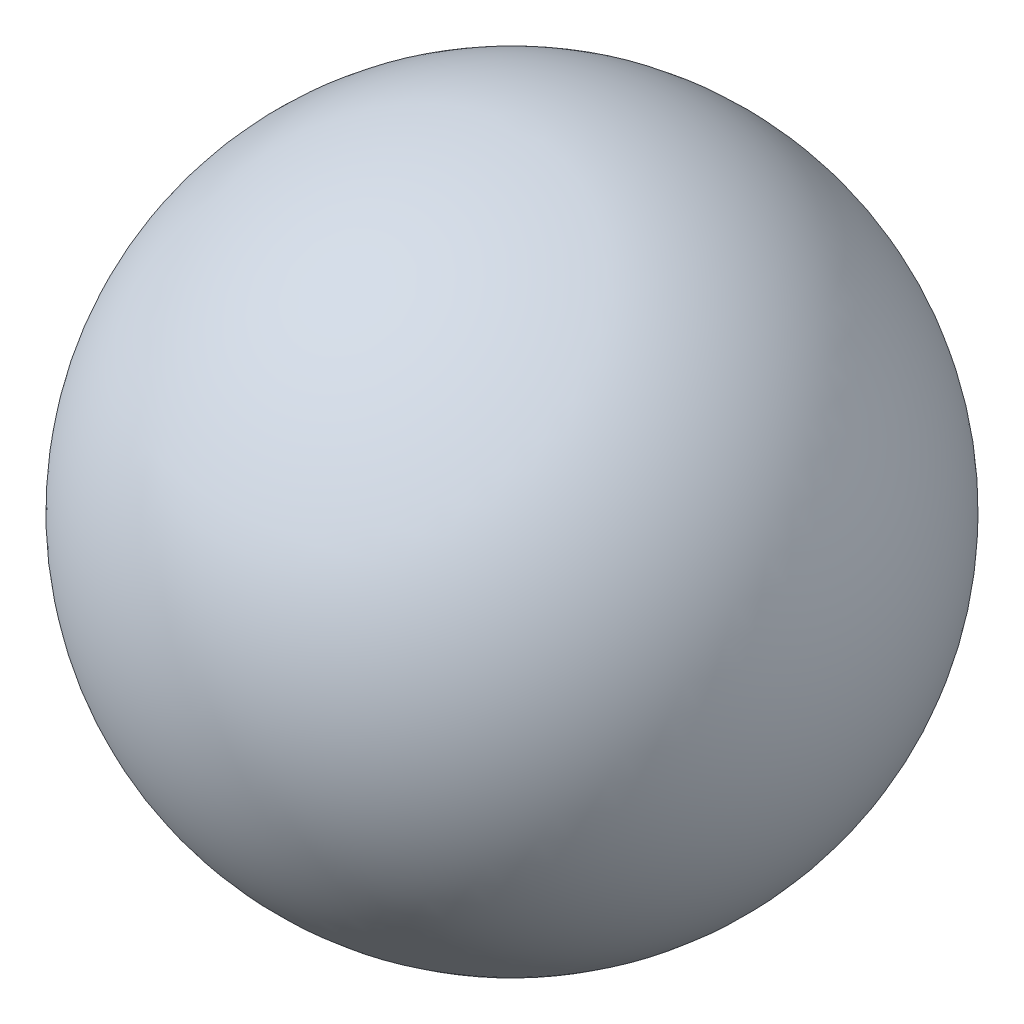
ISO-10303-21;
HEADER;
FILE_DESCRIPTION(('STEP AP214'),'2;1');
FILE_NAME('part.step','',(''),(''),'','','');
FILE_SCHEMA(('AUTOMOTIVE_DESIGN { 1 0 10303 214 1 1 1 1 }'));
ENDSEC;
DATA;
#1=APPLICATION_CONTEXT('core data for automotive mechanical design processes');
#2=APPLICATION_PROTOCOL_DEFINITION('international standard','automotive_design',2000,#1);
#3=PRODUCT_CONTEXT('',#1,'mechanical');
#4=PRODUCT('Part','Part','',(#3));
#5=PRODUCT_RELATED_PRODUCT_CATEGORY('part','',(#4));
#6=PRODUCT_DEFINITION_FORMATION('','',#4);
#7=PRODUCT_DEFINITION_CONTEXT('part definition',#1,'design');
#8=PRODUCT_DEFINITION('design','',#6,#7);
#9=PRODUCT_DEFINITION_SHAPE('','',#8);
#10=(LENGTH_UNIT() NAMED_UNIT(*) SI_UNIT(.MILLI.,.METRE.));
#11=(NAMED_UNIT(*) PLANE_ANGLE_UNIT() SI_UNIT($,.RADIAN.));
#12=(NAMED_UNIT(*) SI_UNIT($,.STERADIAN.) SOLID_ANGLE_UNIT());
#13=UNCERTAINTY_MEASURE_WITH_UNIT(LENGTH_MEASURE(1.E-05),#10,'distance_accuracy_value','');
#14=(GEOMETRIC_REPRESENTATION_CONTEXT(3) GLOBAL_UNCERTAINTY_ASSIGNED_CONTEXT((#13)) GLOBAL_UNIT_ASSIGNED_CONTEXT((#10,
#11,#12)) REPRESENTATION_CONTEXT('',''));
#15=CARTESIAN_POINT('',(0.,0.,0.));
#16=DIRECTION('',(0.,0.,1.));
#17=DIRECTION('',(1.,0.,0.));
#18=AXIS2_PLACEMENT_3D('',#15,#16,#17);
#19=CARTESIAN_POINT('',(0.,30.,0.));
#20=DIRECTION('',(0.,0.,1.));
#21=DIRECTION('',(1.,0.,0.));
#22=AXIS2_PLACEMENT_3D('',#19,#20,#21);
#23=PLANE('',#22);
#24=CARTESIAN_POINT('',(0.,30.,0.));
#25=DIRECTION('',(0.,0.,1.));
#26=DIRECTION('',(1.,0.,0.));
#27=AXIS2_PLACEMENT_3D('',#24,#25,#26);
#28=CIRCLE('',#27,6.325);
#29=CARTESIAN_POINT('',(3.87370946251781,35.,0.));
#30=VERTEX_POINT('',#29);
#31=CARTESIAN_POINT('',(-3.87370946251781,35.,0.));
#32=VERTEX_POINT('',#31);
#33=EDGE_CURVE('E111',#30,#32,#28,.T.);
#34=ORIENTED_EDGE('',*,*,#33,.F.);
#35=DIRECTION('',(-1.,0.,0.));
#36=VECTOR('',#35,1.);
#37=CARTESIAN_POINT('',(0.,35.,0.));
#38=LINE('',#37,#36);
#39=EDGE_CURVE('E160',#30,#32,#38,.T.);
#40=ORIENTED_EDGE('',*,*,#39,.T.);
#41=EDGE_LOOP('',(#34,#40));
#42=FACE_BOUND('',#41,.T.);
#43=ADVANCED_FACE('F38',(#42),#23,.F.);
#44=CARTESIAN_POINT('',(-5.,33.8737094625178,0.));
#45=VERTEX_POINT('',#44);
#46=CARTESIAN_POINT('',(-5.,26.1262905374822,0.));
#47=VERTEX_POINT('',#46);
#48=EDGE_CURVE('E105',#45,#47,#28,.T.);
#49=ORIENTED_EDGE('',*,*,#48,.F.);
#50=DIRECTION('',(0.,-1.,0.));
#51=VECTOR('',#50,1.);
#52=CARTESIAN_POINT('',(-5.,30.,0.));
#53=LINE('',#52,#51);
#54=EDGE_CURVE('E99',#47,#45,#53,.F.);
#55=ORIENTED_EDGE('',*,*,#54,.F.);
#56=EDGE_LOOP('',(#49,#55));
#57=FACE_BOUND('',#56,.T.);
#58=ADVANCED_FACE('F175',(#57),#23,.F.);
#59=CARTESIAN_POINT('',(0.,30.,0.));
#60=DIRECTION('',(0.,-1.,0.));
#61=DIRECTION('',(-1.,0.,0.));
#62=AXIS2_PLACEMENT_3D('',#59,#60,#61);
#63=SPHERICAL_SURFACE('',#62,30.);
#64=CARTESIAN_POINT('',(0.,30.,-29.3256606916196));
#65=DIRECTION('',(0.,0.,1.));
#66=DIRECTION('',(1.,0.,0.));
#67=AXIS2_PLACEMENT_3D('',#64,#65,#66);
#68=CIRCLE('',#67,6.325);
#69=CARTESIAN_POINT('',(6.325,30.,-29.3256606916196));
#70=VERTEX_POINT('',#69);
#71=EDGE_CURVE('E100',#70,#70,#68,.F.);
#72=ORIENTED_EDGE('',*,*,#71,.F.);
#73=EDGE_LOOP('',(#72));
#74=FACE_BOUND('',#73,.T.);
#75=CARTESIAN_POINT('',(0.,0.419601084501918,0.));
#76=DIRECTION('',(0.,1.,0.));
#77=DIRECTION('',(0.,0.,1.));
#78=AXIS2_PLACEMENT_3D('',#75,#76,#77);
#79=CIRCLE('',#78,5.);
#80=CARTESIAN_POINT('',(0.,0.419601084501918,5.));
#81=VERTEX_POINT('',#80);
#82=EDGE_CURVE('E107',#81,#81,#79,.T.);
#83=ORIENTED_EDGE('',*,*,#82,.T.);
#84=EDGE_LOOP('',(#83));
#85=FACE_BOUND('',#84,.T.);
#86=ADVANCED_FACE('F177',(#74,#85),#63,.T.);
#87=CARTESIAN_POINT('',(0.,30.,-35.));
#88=DIRECTION('',(0.,0.,1.));
#89=DIRECTION('',(1.,0.,0.));
#90=AXIS2_PLACEMENT_3D('',#87,#88,#89);
#91=CYLINDRICAL_SURFACE('',#90,6.325);
#92=ORIENTED_EDGE('',*,*,#71,.T.);
#93=EDGE_LOOP('',(#92));
#94=FACE_BOUND('',#93,.T.);
#95=CARTESIAN_POINT('',(5.,26.1262905374822,0.));
#96=CARTESIAN_POINT('',(5.00002215990569,26.1263500669757,-0.0963123124597829));
#97=CARTESIAN_POINT('',(4.99721823765796,26.1227002121737,-0.192589029495187));
#98=CARTESIAN_POINT('',(4.98613621279756,26.1084431338061,-0.384155402048068));
#99=CARTESIAN_POINT('',(4.97786708605443,26.0978473182865,-0.479446416258402));
#100=CARTESIAN_POINT('',(4.95617290452398,26.0703361589931,-0.667222877225731));
#101=CARTESIAN_POINT('',(4.94281597187234,26.0535043884465,-0.759728673406279));
#102=CARTESIAN_POINT('',(4.91120275145371,26.0142314297893,-0.942715159353085));
#103=CARTESIAN_POINT('',(4.8929441117343,25.9917875492138,-1.03319485431026));
#104=CARTESIAN_POINT('',(4.84469186013526,25.9334946420499,-1.2426458170073));
#105=CARTESIAN_POINT('',(4.81282379759819,25.8956943227622,-1.36064336252905));
#106=CARTESIAN_POINT('',(4.74138048780479,25.8133660152691,-1.59184380646212));
#107=CARTESIAN_POINT('',(4.70180265644325,25.7688357725011,-1.70504508176247));
#108=CARTESIAN_POINT('',(4.61519298294151,25.6745239744254,-1.92725348503715));
#109=CARTESIAN_POINT('',(4.56811398835707,25.6247099155351,-2.03622826290285));
#110=CARTESIAN_POINT('',(4.46707971735257,25.5216030160014,-2.24924425513877));
#111=CARTESIAN_POINT('',(4.41312247695653,25.4683091838914,-2.35328404871338));
#112=CARTESIAN_POINT('',(4.27919032217002,25.3411028039426,-2.59093129310676));
#113=CARTESIAN_POINT('',(4.1965961374112,25.2663249467098,-2.72260620617775));
#114=CARTESIAN_POINT('',(4.01995184883474,25.1154195349953,-2.9772481074001));
#115=CARTESIAN_POINT('',(3.9258979102402,25.0392915360372,-3.1002121587484));
#116=CARTESIAN_POINT('',(3.72673030293976,24.8879838316645,-3.33696747008663));
#117=CARTESIAN_POINT('',(3.62163930524101,24.8128025243237,-3.45077671684987));
#118=CARTESIAN_POINT('',(3.40038634375665,24.6651417928239,-3.66899545567669));
#119=CARTESIAN_POINT('',(3.28422296604909,24.5926627153828,-3.77340374393632));
#120=CARTESIAN_POINT('',(2.96630772767672,24.4091231311246,-4.03301091855351));
#121=CARTESIAN_POINT('',(2.75571118210646,24.3016214540876,-4.1801511965195));
#122=CARTESIAN_POINT('',(2.30782363944111,24.1060053925234,-4.4431089440391));
#123=CARTESIAN_POINT('',(2.07056958870473,24.0178646633935,-4.55896902664719));
#124=CARTESIAN_POINT('',(1.61264285241522,23.8801443192246,-4.73811583075012));
#125=CARTESIAN_POINT('',(1.39531050902792,23.8266655902658,-4.80682695869841));
#126=CARTESIAN_POINT('',(1.06086113603286,23.7635627637291,-4.88751377026154));
#127=CARTESIAN_POINT('',(0.947936371161891,23.7453783102882,-4.91068278149828));
#128=CARTESIAN_POINT('',(0.719981933243062,23.7150623453049,-4.9492385441858));
#129=CARTESIAN_POINT('',(0.604953114159795,23.7029284321851,-4.9646283833749));
#130=CARTESIAN_POINT('',(0.373184582371842,23.6849445909763,-4.98741898760948));
#131=CARTESIAN_POINT('',(0.25644008737272,23.6791182787872,-4.99478972935236));
#132=CARTESIAN_POINT('',(0.0226204943393651,23.673960151296,-5.00131577206183));
#133=CARTESIAN_POINT('',(-0.0944544602738625,23.6746258544806,-5.00047421210551));
#134=CARTESIAN_POINT('',(-0.32806693948226,23.6824324122936,-4.99059558391115));
#135=CARTESIAN_POINT('',(-0.444604328728926,23.6895748167942,-4.98155655402161));
#136=CARTESIAN_POINT('',(-0.676202456375065,23.7101754971711,-4.95543454743454));
#137=CARTESIAN_POINT('',(-0.791263224709447,23.7236336448025,-4.93835173407067));
#138=CARTESIAN_POINT('',(-1.01321095385844,23.7557270673342,-4.89749640476802));
#139=CARTESIAN_POINT('',(-1.12021378686689,23.7740601883902,-4.87411350710475));
#140=CARTESIAN_POINT('',(-1.33153995438364,23.8158067098254,-4.82067393781666));
#141=CARTESIAN_POINT('',(-1.43586241214606,23.8392217494148,-4.79061511274948));
#142=CARTESIAN_POINT('',(-1.74394343050199,23.916496551248,-4.6909667574753));
#143=CARTESIAN_POINT('',(-1.94295962939164,23.9774075873311,-4.61187822115691));
#144=CARTESIAN_POINT('',(-2.3438539545954,24.1210736910526,-4.42270444006332));
#145=CARTESIAN_POINT('',(-2.54406791240566,24.2053935091191,-4.31032695266239));
#146=CARTESIAN_POINT('',(-2.92321447230977,24.387094781965,-4.06277422700088));
#147=CARTESIAN_POINT('',(-3.10213842326236,24.4844815124842,-3.92758977477));
#148=CARTESIAN_POINT('',(-3.47229607473002,24.7080729549253,-3.60758692683995));
#149=CARTESIAN_POINT('',(-3.65856781897332,24.8360988115131,-3.41827152687097));
#150=CARTESIAN_POINT('',(-3.91346404200393,25.0298977244601,-3.11485076518627));
#151=CARTESIAN_POINT('',(-3.99444058321372,25.0948831787991,-3.01030876290175));
#152=CARTESIAN_POINT('',(-4.14807686850704,25.2241091485609,-2.79481049081281));
#153=CARTESIAN_POINT('',(-4.2207376371153,25.2883497548726,-2.68385501370566));
#154=CARTESIAN_POINT('',(-4.34935572512073,25.40702124788,-2.46917818436625));
#155=CARTESIAN_POINT('',(-4.40627168045877,25.4617086414901,-2.36617119055845));
#156=CARTESIAN_POINT('',(-4.5132327155104,25.5680660918028,-2.15516061905288));
#157=CARTESIAN_POINT('',(-4.56327927251677,25.6197367958792,-2.04715812235941));
#158=CARTESIAN_POINT('',(-4.65588346955843,25.7183039292838,-1.82673382522248));
#159=CARTESIAN_POINT('',(-4.6984830936886,25.7652264513473,-1.71434148054973));
#160=CARTESIAN_POINT('',(-4.77605083548296,25.8529058068027,-1.48459691063914));
#161=CARTESIAN_POINT('',(-4.81102032164443,25.8936637454354,-1.36724557933067));
#162=CARTESIAN_POINT('',(-4.86719137009636,25.9604913766623,-1.149241215604));
#163=CARTESIAN_POINT('',(-4.88973607020151,25.987884255695,-1.0493421242029));
#164=CARTESIAN_POINT('',(-4.92884182715137,26.0360247167883,-0.846845649933849));
#165=CARTESIAN_POINT('',(-4.94540653232967,26.0567763497248,-0.744249953368702));
#166=CARTESIAN_POINT('',(-4.97237482456399,26.0908282215501,-0.535443117661064));
#167=CARTESIAN_POINT('',(-4.98268522317401,26.1040156041477,-0.429201090052687));
#168=CARTESIAN_POINT('',(-4.99652229524022,26.121801681662,-0.215328025426039));
#169=CARTESIAN_POINT('',(-5.00003347488726,26.126380759601,-0.107694377289787));
#170=CARTESIAN_POINT('',(-5.00000000000002,26.1262905374821,0.));
#171=B_SPLINE_CURVE_WITH_KNOTS('',3,(#95,#96,#97,#98,#99,#100,#101,#102,#103,#104,#105,#106,
#107,#108,#109,#110,#111,#112,#113,#114,#115,#116,#117,#118,#119,#120,#121,#122,#123,#124,#125,
#126,#127,#128,#129,#130,#131,#132,#133,#134,#135,#136,#137,#138,#139,#140,#141,#142,#143,#144,
#145,#146,#147,#148,#149,#150,#151,#152,#153,#154,#155,#156,#157,#158,#159,#160,#161,#162,#163,
#164,#165,#166,#167,#168,#169,#170),.UNSPECIFIED.,.F.,.F.,(4,2,2,2,2,2,2,2,2,2,2,2,2,2,2,2,2,2,
2,2,2,2,2,2,2,2,2,2,2,2,2,2,2,2,2,2,2,4),(0.,0.288770139525526,0.577067187245141,
0.861632607390289,1.14633481340648,1.52954347571257,1.91288080084353,2.29873045910826,
2.68469053855319,3.20148747157686,3.71845781775387,4.23438629826341,4.75038075035249,
5.58241128358443,6.41330255458571,7.11238236151246,7.46212032867757,7.81171936730637,
8.16262283910243,8.51339218651603,8.86424549505842,9.2150916796288,9.54787797706081,
9.88077177710585,10.5461198981981,11.2772817723524,12.0087397449738,12.8897406790411,
13.3314830413026,13.7731709210399,14.1622063953371,14.5511580744105,14.9378407718599,
15.3244540590309,15.6421258283145,15.9596034604663,16.2817021789128,16.6045340242698),.UNSPECIFIED.);
#172=CARTESIAN_POINT('',(5.,26.1262905374822,0.));
#173=VERTEX_POINT('',#172);
#174=EDGE_CURVE('E93',#173,#47,#171,.T.);
#175=ORIENTED_EDGE('',*,*,#174,.F.);
#176=CARTESIAN_POINT('',(5.,33.8737094625178,0.));
#177=VERTEX_POINT('',#176);
#178=EDGE_CURVE('E103',#173,#177,#28,.T.);
#179=ORIENTED_EDGE('',*,*,#178,.T.);
#180=CARTESIAN_POINT('',(5.,33.8737094625178,0.));
#181=CARTESIAN_POINT('',(4.99999991431388,33.8737096885773,0.0213453043152271));
#182=CARTESIAN_POINT('',(4.99986328175209,33.873886028122,0.0426859510760669));
#183=CARTESIAN_POINT('',(4.99931692287718,33.8745909341817,0.0853579294887467));
#184=CARTESIAN_POINT('',(4.99890719656407,33.8751195006967,0.106689261140587));
#185=CARTESIAN_POINT('',(4.9983609233753,33.875824180697,0.12801593523804));
#186=B_SPLINE_CURVE_WITH_KNOTS('',3,(#180,#181,#182,#183,#184,#185),.UNSPECIFIED.,.F.,.F.,(4,2,
4),(0.,0.0640254380255696,0.128050876050464),.UNSPECIFIED.);
#187=CARTESIAN_POINT('',(4.99836092337529,33.8758241806969,0.12801593523804));
#188=VERTEX_POINT('',#187);
#189=EDGE_CURVE('E43',#177,#188,#186,.T.);
#190=ORIENTED_EDGE('',*,*,#189,.T.);
#191=CARTESIAN_POINT('',(3.87370946251781,35.,0.));
#192=CARTESIAN_POINT('',(3.98293480894709,34.9154001486259,2.76817009595661E-06));
#193=CARTESIAN_POINT('',(4.08939830568528,34.827169647157,0.00214819165728));
#194=CARTESIAN_POINT('',(4.29552814246442,34.644657519315,0.0118098650661881));
#195=CARTESIAN_POINT('',(4.39523350459646,34.5504180769819,0.0192917719463984));
#196=CARTESIAN_POINT('',(4.5879986720903,34.3559863408574,0.0406856577421378));
#197=CARTESIAN_POINT('',(4.68105734279876,34.2557930360078,0.0545987315044138));
#198=CARTESIAN_POINT('',(4.86048344604895,34.049717267845,0.0900116054872135));
#199=CARTESIAN_POINT('',(4.9468040830105,33.9438024084645,0.111559541193848));
#200=CARTESIAN_POINT('',(5.02913883848106,33.8358033765147,0.137423910943361));
#201=B_SPLINE_CURVE_WITH_KNOTS('',3,(#191,#192,#193,#194,#195,#196,#197,#198,#199,#200),
.UNSPECIFIED.,.F.,.F.,(4,2,2,2,4),(0.,0.414438319069897,0.826233301629811,1.23809841431486,
1.65260782050425),.UNSPECIFIED.);
#202=EDGE_CURVE('E157',#188,#30,#201,.F.);
#203=ORIENTED_EDGE('',*,*,#202,.T.);
#204=ORIENTED_EDGE('',*,*,#33,.T.);
#205=CARTESIAN_POINT('',(-3.87370946251781,35.,0.));
#206=CARTESIAN_POINT('',(-3.98293480894709,34.9154001486259,2.76817009595661E-06));
#207=CARTESIAN_POINT('',(-4.08939830568528,34.827169647157,0.00214819165728));
#208=CARTESIAN_POINT('',(-4.29552814246442,34.644657519315,0.0118098650661881));
#209=CARTESIAN_POINT('',(-4.39523350459646,34.5504180769819,0.0192917719463984));
#210=CARTESIAN_POINT('',(-4.5879986720903,34.3559863408574,0.0406856577421378));
#211=CARTESIAN_POINT('',(-4.68105734279876,34.2557930360078,0.0545987315044138));
#212=CARTESIAN_POINT('',(-4.86048344604895,34.049717267845,0.0900116054872135));
#213=CARTESIAN_POINT('',(-4.9468040830105,33.9438024084645,0.111559541193848));
#214=CARTESIAN_POINT('',(-5.02913883848106,33.8358033765147,0.137423910943361));
#215=B_SPLINE_CURVE_WITH_KNOTS('',3,(#205,#206,#207,#208,#209,#210,#211,#212,#213,#214),
.UNSPECIFIED.,.F.,.F.,(4,2,2,2,4),(0.,0.414438319069897,0.826233301629811,1.23809841431486,
1.65260782050425),.UNSPECIFIED.);
#216=CARTESIAN_POINT('',(-4.99836092337529,33.8758241806969,0.12801593523804));
#217=VERTEX_POINT('',#216);
#218=EDGE_CURVE('E61',#32,#217,#215,.T.);
#219=ORIENTED_EDGE('',*,*,#218,.T.);
#220=CARTESIAN_POINT('',(-4.99836092337529,33.8758241806969,0.12801593523804));
#221=CARTESIAN_POINT('',(-4.99890719656407,33.8751195006967,0.106689261140586));
#222=CARTESIAN_POINT('',(-4.99931692287718,33.8745909341817,0.0853579294887459));
#223=CARTESIAN_POINT('',(-4.99986328175209,33.873886028122,0.0426859510760653));
#224=CARTESIAN_POINT('',(-4.99999991431388,33.8737096885773,0.0213453043152251));
#225=CARTESIAN_POINT('',(-5.,33.8737094625179,0.));
#226=B_SPLINE_CURVE_WITH_KNOTS('',3,(#220,#221,#222,#223,#224,#225),.UNSPECIFIED.,.F.,.F.,(4,2,
4),(0.,0.0640254380248947,0.128050876050465),.UNSPECIFIED.);
#227=EDGE_CURVE('E11',#45,#217,#226,.F.);
#228=ORIENTED_EDGE('',*,*,#227,.F.);
#229=ORIENTED_EDGE('',*,*,#48,.T.);
#230=EDGE_LOOP('',(#175,#179,#190,#203,#204,#219,#228,#229));
#231=FACE_BOUND('',#230,.T.);
#232=ADVANCED_FACE('F102',(#94,#231),#91,.F.);
#233=DIRECTION('',(0.,-1.,0.));
#234=VECTOR('',#233,1.);
#235=CARTESIAN_POINT('',(5.,30.,0.));
#236=LINE('',#235,#234);
#237=EDGE_CURVE('E90',#177,#173,#236,.T.);
#238=ORIENTED_EDGE('',*,*,#237,.F.);
#239=ORIENTED_EDGE('',*,*,#178,.F.);
#240=EDGE_LOOP('',(#238,#239));
#241=FACE_BOUND('',#240,.T.);
#242=ADVANCED_FACE('F109',(#241),#23,.F.);
#243=CARTESIAN_POINT('',(0.,30.,0.));
#244=DIRECTION('',(0.,-1.,0.));
#245=DIRECTION('',(0.,0.,-1.));
#246=AXIS2_PLACEMENT_3D('',#243,#244,#245);
#247=CYLINDRICAL_SURFACE('',#246,5.);
#248=ORIENTED_EDGE('',*,*,#82,.F.);
#249=EDGE_LOOP('',(#248));
#250=FACE_BOUND('',#249,.T.);
#251=ORIENTED_EDGE('',*,*,#54,.T.);
#252=ORIENTED_EDGE('',*,*,#227,.T.);
#253=CARTESIAN_POINT('',(-5.,35.,0.));
#254=CARTESIAN_POINT('',(-4.99995708928931,34.8608120212266,-1.45013408786158E-05));
#255=CARTESIAN_POINT('',(-4.99999864882734,34.7216260771224,0.00581138983767137));
#256=CARTESIAN_POINT('',(-4.99994062123228,34.4442241499699,0.0290396320068588));
#257=CARTESIAN_POINT('',(-4.99984103495852,34.3060081610213,0.0464419125177648));
#258=CARTESIAN_POINT('',(-4.99919006365314,34.0312689301418,0.0927593052125488));
#259=CARTESIAN_POINT('',(-4.9986378843255,33.894749092874,0.121694611836417));
#260=CARTESIAN_POINT('',(-4.996476137854,33.6246126388626,0.190868483485781));
#261=CARTESIAN_POINT('',(-4.99486658439107,33.4909959845791,0.231106902261012));
#262=CARTESIAN_POINT('',(-4.98978938304455,33.2274699578079,0.322648645389495));
#263=CARTESIAN_POINT('',(-4.9863196239305,33.0975649746581,0.373964502414275));
#264=CARTESIAN_POINT('',(-4.97652815328976,32.8425925255067,0.487234762431443));
#265=CARTESIAN_POINT('',(-4.97020661972915,32.7175247581655,0.549188501413262));
#266=CARTESIAN_POINT('',(-4.95356877124832,32.4732880671638,0.683159661724834));
#267=CARTESIAN_POINT('',(-4.94325541306139,32.3541148509366,0.755169609274052));
#268=CARTESIAN_POINT('',(-4.91736953591812,32.1225714846087,0.908583863374879));
#269=CARTESIAN_POINT('',(-4.9017973543741,32.0102008985886,0.989987566991456));
#270=CARTESIAN_POINT('',(-4.86480378516127,31.7974893781012,1.15792167683926));
#271=CARTESIAN_POINT('',(-4.84363353690537,31.6968505112529,1.24412940638407));
#272=CARTESIAN_POINT('',(-4.79404906757774,31.5036555264278,1.42328020163077));
#273=CARTESIAN_POINT('',(-4.76563501243073,31.4110992233793,1.51622311302346));
#274=CARTESIAN_POINT('',(-4.70054216638891,31.2349781851851,1.70736024185755));
#275=CARTESIAN_POINT('',(-4.66387390989616,31.1514021880584,1.80554764526216));
#276=CARTESIAN_POINT('',(-4.58138854271998,30.9937550745697,2.00563618565317));
#277=CARTESIAN_POINT('',(-4.53557302430703,30.9196823076546,2.10753667378008));
#278=CARTESIAN_POINT('',(-4.44113303338272,30.7908509665211,2.29916172430253));
#279=CARTESIAN_POINT('',(-4.39374216508619,30.7348359456743,2.38865320038453));
#280=CARTESIAN_POINT('',(-4.29154236529257,30.6302332780692,2.56773990649322));
#281=CARTESIAN_POINT('',(-4.23673386293921,30.5816452019746,2.65733513022056));
#282=CARTESIAN_POINT('',(-4.11972699368197,30.4917602795158,2.83534745225242));
#283=CARTESIAN_POINT('',(-4.05752841471128,30.4504636424726,2.92376451666728));
#284=CARTESIAN_POINT('',(-3.92595291858719,30.3748312765304,3.09819743947015));
#285=CARTESIAN_POINT('',(-3.85657595937933,30.3404955884157,3.1842132837869));
#286=CARTESIAN_POINT('',(-3.71525064571075,30.28009895079,3.34782188260945));
#287=CARTESIAN_POINT('',(-3.64368725115055,30.2536725908872,3.42561345855557));
#288=CARTESIAN_POINT('',(-3.494882459983,30.2060190697223,3.57730182584892));
#289=CARTESIAN_POINT('',(-3.41763925682175,30.1847935720587,3.65119736505533));
#290=CARTESIAN_POINT('',(-3.25795449384787,30.1469663985606,3.79436830034698));
#291=CARTESIAN_POINT('',(-3.17551396703401,30.1303638074273,3.86364460893453));
#292=CARTESIAN_POINT('',(-3.00586200428445,30.1011464490335,3.99705453963438));
#293=CARTESIAN_POINT('',(-2.91864884184294,30.0885331362352,4.06118627972833));
#294=CARTESIAN_POINT('',(-2.73115121408323,30.0655935253332,4.18986655713145));
#295=CARTESIAN_POINT('',(-2.63042531223544,30.0556147861359,4.25383415606468));
#296=CARTESIAN_POINT('',(-2.42441584466992,30.0389018200964,4.37452495119236));
#297=CARTESIAN_POINT('',(-2.31913029357587,30.032169022411,4.43124494827451));
#298=CARTESIAN_POINT('',(-2.10460607417448,30.021192723441,4.53706350719887));
#299=CARTESIAN_POINT('',(-1.99536536307358,30.0169505285711,4.58615805929735));
#300=CARTESIAN_POINT('',(-1.77359308457621,30.0102776886979,4.67639840315887));
#301=CARTESIAN_POINT('',(-1.66106131671163,30.0078471542881,4.71754370954364));
#302=CARTESIAN_POINT('',(-1.42252682704729,30.0040319160146,4.79516422593863));
#303=CARTESIAN_POINT('',(-1.29625752473594,30.0027680349196,4.83082830411142));
#304=CARTESIAN_POINT('',(-1.0412939494122,30.0010703993905,4.8921266534371));
#305=CARTESIAN_POINT('',(-0.912599461519846,30.0006367188676,4.91776003141337));
#306=CARTESIAN_POINT('',(-0.653653996306246,30.0001249251298,4.95882086067167));
#307=CARTESIAN_POINT('',(-0.523403782847282,30.0000466440719,4.97425312664534));
#308=CARTESIAN_POINT('',(-0.262102720855088,30.0000010906685,4.99484811311852));
#309=CARTESIAN_POINT('',(-0.13105192516155,30.0000338110739,5.00001150418901));
#310=CARTESIAN_POINT('',(0.,30.,5.));
#311=B_SPLINE_CURVE_WITH_KNOTS('',3,(#253,#254,#255,#256,#257,#258,#259,#260,#261,#262,#263,
#264,#265,#266,#267,#268,#269,#270,#271,#272,#273,#274,#275,#276,#277,#278,#279,#280,#281,#282,
#283,#284,#285,#286,#287,#288,#289,#290,#291,#292,#293,#294,#295,#296,#297,#298,#299,#300,#301,
#302,#303,#304,#305,#306,#307,#308,#309,#310),.UNSPECIFIED.,.F.,.F.,(4,2,2,2,2,2,2,2,2,2,2,2,2,
2,2,2,2,2,2,2,2,2,2,2,2,2,2,2,4),(0.,0.417439173640649,0.834875805838476,1.25304660748524,
1.67121199869517,2.08985299230128,2.50846786406669,2.92677326051622,3.34505182309424,
3.74705690218071,4.14905277387272,4.55053847926642,4.95195435859016,5.29866782167456,
5.64536123438281,5.99206459826369,6.33876999341716,6.66528709743993,6.9919085084582,
7.31846520496784,7.64514082481226,8.0039878620372,8.36299275219285,8.72218578604452,
9.08140074517576,9.47462987042457,9.8678940025203,10.2609723901561,10.6540251084155),.UNSPECIFIED.);
#312=CARTESIAN_POINT('',(0.,30.,5.));
#313=VERTEX_POINT('',#312);
#314=EDGE_CURVE('E137',#217,#313,#311,.T.);
#315=ORIENTED_EDGE('',*,*,#314,.T.);
#316=CARTESIAN_POINT('',(0.,30.,5.));
#317=CARTESIAN_POINT('',(0.139187978773439,30.0000429107107,5.00001450134088));
#318=CARTESIAN_POINT('',(0.278373922877591,30.0000013511727,4.99418861016233));
#319=CARTESIAN_POINT('',(0.555775850030134,30.0000593787677,4.97096036799314));
#320=CARTESIAN_POINT('',(0.693991838978659,30.0001589650415,4.95355808748223));
#321=CARTESIAN_POINT('',(0.968731069858208,30.0008099363469,4.90724069478745));
#322=CARTESIAN_POINT('',(1.10525090712603,30.0013621156745,4.87830538816358));
#323=CARTESIAN_POINT('',(1.37538736113736,30.003523862146,4.80913151651422));
#324=CARTESIAN_POINT('',(1.50900401542086,30.0051334156089,4.76889309773899));
#325=CARTESIAN_POINT('',(1.77253004219205,30.0102106169555,4.67735135461051));
#326=CARTESIAN_POINT('',(1.90243502534188,30.0136803760695,4.62603549758572));
#327=CARTESIAN_POINT('',(2.15740747449329,30.0234718467102,4.51276523756856));
#328=CARTESIAN_POINT('',(2.2824752418345,30.0297933802708,4.45081149858674));
#329=CARTESIAN_POINT('',(2.52671193283625,30.0464312287517,4.31684033827516));
#330=CARTESIAN_POINT('',(2.64588514906344,30.0567445869386,4.24483039072594));
#331=CARTESIAN_POINT('',(2.87742851539129,30.0826304640819,4.09141613662512));
#332=CARTESIAN_POINT('',(2.98979910141141,30.0982026456259,4.01001243300854));
#333=CARTESIAN_POINT('',(3.20251062189879,30.1351962148387,3.84207832316074));
#334=CARTESIAN_POINT('',(3.30314948874713,30.1563664630946,3.75587059361592));
#335=CARTESIAN_POINT('',(3.49634447357216,30.2059509324223,3.57671979836923));
#336=CARTESIAN_POINT('',(3.58890077662072,30.2343649875693,3.48377688697654));
#337=CARTESIAN_POINT('',(3.76502181481488,30.2994578336111,3.29263975814245));
#338=CARTESIAN_POINT('',(3.84859781194161,30.3361260901038,3.19445235473784));
#339=CARTESIAN_POINT('',(4.00624492543027,30.41861145728,2.99436381434683));
#340=CARTESIAN_POINT('',(4.0803176923454,30.464426975693,2.89246332621992));
#341=CARTESIAN_POINT('',(4.20914903347894,30.5588669666173,2.70083827569746));
#342=CARTESIAN_POINT('',(4.2651640543257,30.6062578349138,2.61134679961547));
#343=CARTESIAN_POINT('',(4.36976672193076,30.7084576347074,2.43226009350678));
#344=CARTESIAN_POINT('',(4.4183547980254,30.7632661370608,2.34266486977944));
#345=CARTESIAN_POINT('',(4.50823972048417,30.880273006318,2.16465254774759));
#346=CARTESIAN_POINT('',(4.54953635752743,30.9424715852887,2.07623548333273));
#347=CARTESIAN_POINT('',(4.62516872346956,31.0740470814128,1.90180256052985));
#348=CARTESIAN_POINT('',(4.65950441158431,31.1434240406207,1.8157867162131));
#349=CARTESIAN_POINT('',(4.71990104921,31.2847493542892,1.65217811739055));
#350=CARTESIAN_POINT('',(4.7463274091128,31.3563127488494,1.57438654144443));
#351=CARTESIAN_POINT('',(4.79398093027769,31.505117540017,1.42269817415108));
#352=CARTESIAN_POINT('',(4.81520642794132,31.5823607431783,1.34880263494467));
#353=CARTESIAN_POINT('',(4.8530336014394,31.7420455061521,1.20563169965302));
#354=CARTESIAN_POINT('',(4.86963619257271,31.824486032966,1.13635539106547));
#355=CARTESIAN_POINT('',(4.89885355096649,31.9941379957156,1.00294546036562));
#356=CARTESIAN_POINT('',(4.91146686376484,32.0813511581571,0.938813720271665));
#357=CARTESIAN_POINT('',(4.93440647466678,32.2688487859168,0.810133442868552));
#358=CARTESIAN_POINT('',(4.94438521386408,32.3695746877646,0.746165843935319));
#359=CARTESIAN_POINT('',(4.96109817990358,32.5755841553301,0.625475048807637));
#360=CARTESIAN_POINT('',(4.96783097758898,32.6808697064241,0.568755051725493));
#361=CARTESIAN_POINT('',(4.97880727655903,32.8953939258255,0.462936492801128));
#362=CARTESIAN_POINT('',(4.98304947142894,33.0046346369264,0.413841940702653));
#363=CARTESIAN_POINT('',(4.98972231130214,33.2264069154238,0.323601596841131));
#364=CARTESIAN_POINT('',(4.99215284571193,33.3389386832884,0.282456290456364));
#365=CARTESIAN_POINT('',(4.9959680839854,33.5774731729527,0.20483577406137));
#366=CARTESIAN_POINT('',(4.99723196508037,33.7037424752641,0.169171695888586));
#367=CARTESIAN_POINT('',(4.9989296006095,33.9587060505878,0.1078733465629));
#368=CARTESIAN_POINT('',(4.9993632811324,34.0874005384802,0.0822399685866263));
#369=CARTESIAN_POINT('',(4.99987507487021,34.3463460036938,0.0411791393283273));
#370=CARTESIAN_POINT('',(4.99995335592805,34.4765962171527,0.0257468733546594));
#371=CARTESIAN_POINT('',(4.99999890933154,34.7378972791449,0.00515188688148042));
#372=CARTESIAN_POINT('',(4.99996618892609,34.8689480748384,-1.15041890063837E-05));
#373=CARTESIAN_POINT('',(5.,35.,0.));
#374=B_SPLINE_CURVE_WITH_KNOTS('',3,(#316,#317,#318,#319,#320,#321,#322,#323,#324,#325,#326,
#327,#328,#329,#330,#331,#332,#333,#334,#335,#336,#337,#338,#339,#340,#341,#342,#343,#344,#345,
#346,#347,#348,#349,#350,#351,#352,#353,#354,#355,#356,#357,#358,#359,#360,#361,#362,#363,#364,
#365,#366,#367,#368,#369,#370,#371,#372,#373),.UNSPECIFIED.,.F.,.F.,(4,2,2,2,2,2,2,2,2,2,2,2,2,
2,2,2,2,2,2,2,2,2,2,2,2,2,2,2,4),(0.,0.417439173640644,0.834875805838472,1.25304660748523,
1.67121199869517,2.08985299230128,2.5084678640667,2.92677326051624,3.34505182309424,
3.74705690218071,4.14905277387272,4.55053847926642,4.95195435859016,5.29866782167456,
5.64536123438281,5.99206459826369,6.33876999341715,6.66528709743993,6.9919085084582,
7.31846520496784,7.64514082481226,8.0039878620372,8.36299275219285,8.72218578604452,
9.08140074517575,9.47462987042457,9.8678940025203,10.260972390156,10.6540251084155),.UNSPECIFIED.);
#375=EDGE_CURVE('E68',#313,#188,#374,.T.);
#376=ORIENTED_EDGE('',*,*,#375,.T.);
#377=ORIENTED_EDGE('',*,*,#189,.F.);
#378=ORIENTED_EDGE('',*,*,#237,.T.);
#379=ORIENTED_EDGE('',*,*,#174,.T.);
#380=EDGE_LOOP('',(#251,#252,#315,#376,#377,#378,#379));
#381=FACE_BOUND('',#380,.T.);
#382=ADVANCED_FACE('F92',(#250,#381),#247,.F.);
#383=CARTESIAN_POINT('',(0.,35.,5.));
#384=DIRECTION('',(-1.,0.,0.));
#385=DIRECTION('',(0.,0.,1.));
#386=AXIS2_PLACEMENT_3D('',#383,#384,#385);
#387=CYLINDRICAL_SURFACE('',#386,5.);
#388=ORIENTED_EDGE('',*,*,#202,.F.);
#389=ORIENTED_EDGE('',*,*,#375,.F.);
#390=ORIENTED_EDGE('',*,*,#314,.F.);
#391=ORIENTED_EDGE('',*,*,#218,.F.);
#392=ORIENTED_EDGE('',*,*,#39,.F.);
#393=EDGE_LOOP('',(#388,#389,#390,#391,#392));
#394=FACE_BOUND('',#393,.T.);
#395=ADVANCED_FACE('F40',(#394),#387,.T.);
#396=CLOSED_SHELL('',(#43,#58,#86,#232,#242,#382,#395));
#397=MANIFOLD_SOLID_BREP('B2',#396);
#398=ADVANCED_BREP_SHAPE_REPRESENTATION('',(#18,#397),#14);
#399=SHAPE_DEFINITION_REPRESENTATION(#9,#398);
ENDSEC;
END-ISO-10303-21;
